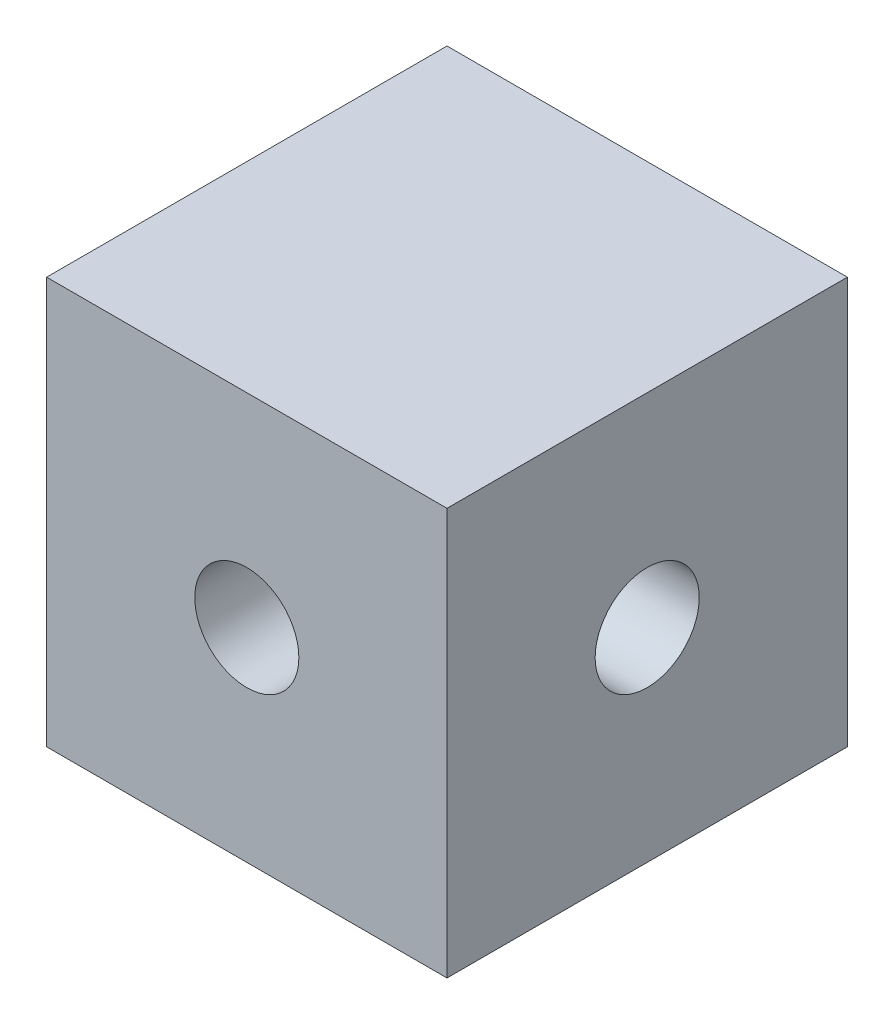
ISO-10303-21;
HEADER;
FILE_DESCRIPTION(('STEP AP214'),'2;1');
FILE_NAME('part.step','',(''),(''),'','','');
FILE_SCHEMA(('AUTOMOTIVE_DESIGN { 1 0 10303 214 1 1 1 1 }'));
ENDSEC;
DATA;
#1=APPLICATION_CONTEXT('core data for automotive mechanical design processes');
#2=APPLICATION_PROTOCOL_DEFINITION('international standard','automotive_design',2000,#1);
#3=PRODUCT_CONTEXT('',#1,'mechanical');
#4=PRODUCT('Part','Part','',(#3));
#5=PRODUCT_RELATED_PRODUCT_CATEGORY('part','',(#4));
#6=PRODUCT_DEFINITION_FORMATION('','',#4);
#7=PRODUCT_DEFINITION_CONTEXT('part definition',#1,'design');
#8=PRODUCT_DEFINITION('design','',#6,#7);
#9=PRODUCT_DEFINITION_SHAPE('','',#8);
#10=(LENGTH_UNIT() NAMED_UNIT(*) SI_UNIT(.MILLI.,.METRE.));
#11=(NAMED_UNIT(*) PLANE_ANGLE_UNIT() SI_UNIT($,.RADIAN.));
#12=(NAMED_UNIT(*) SI_UNIT($,.STERADIAN.) SOLID_ANGLE_UNIT());
#13=UNCERTAINTY_MEASURE_WITH_UNIT(LENGTH_MEASURE(1.E-05),#10,'distance_accuracy_value','');
#14=(GEOMETRIC_REPRESENTATION_CONTEXT(3) GLOBAL_UNCERTAINTY_ASSIGNED_CONTEXT((#13)) GLOBAL_UNIT_ASSIGNED_CONTEXT((#10,
#11,#12)) REPRESENTATION_CONTEXT('',''));
#15=CARTESIAN_POINT('',(0.,0.,0.));
#16=DIRECTION('',(0.,0.,1.));
#17=DIRECTION('',(1.,0.,0.));
#18=AXIS2_PLACEMENT_3D('',#15,#16,#17);
#19=CARTESIAN_POINT('',(10.,20.32,-10.));
#20=DIRECTION('',(-1.,0.,0.));
#21=DIRECTION('',(0.,0.,1.));
#22=AXIS2_PLACEMENT_3D('',#19,#20,#21);
#23=PLANE('',#22);
#24=CARTESIAN_POINT('',(10.,10.16,1.04744440165294E-13));
#25=DIRECTION('',(1.,0.,0.));
#26=DIRECTION('',(0.,0.,-1.));
#27=AXIS2_PLACEMENT_3D('',#24,#25,#26);
#28=CIRCLE('',#27,2.6);
#29=CARTESIAN_POINT('',(10.,10.16,-2.59999999999989));
#30=VERTEX_POINT('',#29);
#31=EDGE_CURVE('E166',#30,#30,#28,.T.);
#32=ORIENTED_EDGE('',*,*,#31,.F.);
#33=EDGE_LOOP('',(#32));
#34=FACE_BOUND('',#33,.T.);
#35=DIRECTION('',(0.,0.,-1.));
#36=VECTOR('',#35,1.);
#37=CARTESIAN_POINT('',(10.,0.,-10.));
#38=LINE('',#37,#36);
#39=CARTESIAN_POINT('',(10.,0.,10.));
#40=VERTEX_POINT('',#39);
#41=CARTESIAN_POINT('',(10.,0.,-10.));
#42=VERTEX_POINT('',#41);
#43=EDGE_CURVE('E110',#40,#42,#38,.T.);
#44=ORIENTED_EDGE('',*,*,#43,.T.);
#45=DIRECTION('',(0.,-1.,0.));
#46=VECTOR('',#45,1.);
#47=CARTESIAN_POINT('',(10.,20.32,-10.));
#48=LINE('',#47,#46);
#49=CARTESIAN_POINT('',(10.,20.32,-10.));
#50=VERTEX_POINT('',#49);
#51=EDGE_CURVE('E11',#50,#42,#48,.T.);
#52=ORIENTED_EDGE('',*,*,#51,.F.);
#53=DIRECTION('',(0.,0.,-1.));
#54=VECTOR('',#53,1.);
#55=CARTESIAN_POINT('',(10.,20.32,-10.));
#56=LINE('',#55,#54);
#57=CARTESIAN_POINT('',(10.,20.32,10.));
#58=VERTEX_POINT('',#57);
#59=EDGE_CURVE('E97',#58,#50,#56,.T.);
#60=ORIENTED_EDGE('',*,*,#59,.F.);
#61=DIRECTION('',(0.,-1.,0.));
#62=VECTOR('',#61,1.);
#63=CARTESIAN_POINT('',(10.,20.32,10.));
#64=LINE('',#63,#62);
#65=EDGE_CURVE('E111',#58,#40,#64,.T.);
#66=ORIENTED_EDGE('',*,*,#65,.T.);
#67=EDGE_LOOP('',(#44,#52,#60,#66));
#68=FACE_BOUND('',#67,.T.);
#69=ADVANCED_FACE('F42',(#34,#68),#23,.F.);
#70=CARTESIAN_POINT('',(-10.,20.32,-10.));
#71=DIRECTION('',(0.,0.,1.));
#72=DIRECTION('',(1.,0.,0.));
#73=AXIS2_PLACEMENT_3D('',#70,#71,#72);
#74=PLANE('',#73);
#75=CARTESIAN_POINT('',(0.,10.16,-10.));
#76=DIRECTION('',(0.,0.,-1.));
#77=DIRECTION('',(-1.,0.,0.));
#78=AXIS2_PLACEMENT_3D('',#75,#76,#77);
#79=CIRCLE('',#78,2.6);
#80=CARTESIAN_POINT('',(-2.6,10.16,-10.));
#81=VERTEX_POINT('',#80);
#82=EDGE_CURVE('E155',#81,#81,#79,.T.);
#83=ORIENTED_EDGE('',*,*,#82,.F.);
#84=EDGE_LOOP('',(#83));
#85=FACE_BOUND('',#84,.T.);
#86=DIRECTION('',(-1.,0.,0.));
#87=VECTOR('',#86,1.);
#88=CARTESIAN_POINT('',(-10.,0.,-10.));
#89=LINE('',#88,#87);
#90=CARTESIAN_POINT('',(-10.,0.,-10.));
#91=VERTEX_POINT('',#90);
#92=EDGE_CURVE('E115',#42,#91,#89,.T.);
#93=ORIENTED_EDGE('',*,*,#92,.T.);
#94=DIRECTION('',(0.,-1.,0.));
#95=VECTOR('',#94,1.);
#96=CARTESIAN_POINT('',(-10.,20.32,-10.));
#97=LINE('',#96,#95);
#98=CARTESIAN_POINT('',(-10.,20.32,-10.));
#99=VERTEX_POINT('',#98);
#100=EDGE_CURVE('E50',#99,#91,#97,.T.);
#101=ORIENTED_EDGE('',*,*,#100,.F.);
#102=DIRECTION('',(-1.,0.,0.));
#103=VECTOR('',#102,1.);
#104=CARTESIAN_POINT('',(-10.,20.32,-10.));
#105=LINE('',#104,#103);
#106=EDGE_CURVE('E87',#50,#99,#105,.T.);
#107=ORIENTED_EDGE('',*,*,#106,.F.);
#108=ORIENTED_EDGE('',*,*,#51,.T.);
#109=EDGE_LOOP('',(#93,#101,#107,#108));
#110=FACE_BOUND('',#109,.T.);
#111=ADVANCED_FACE('F89',(#85,#110),#74,.F.);
#112=CARTESIAN_POINT('',(-10.,20.32,-10.));
#113=DIRECTION('',(1.,0.,0.));
#114=DIRECTION('',(0.,0.,-1.));
#115=AXIS2_PLACEMENT_3D('',#112,#113,#114);
#116=PLANE('',#115);
#117=CARTESIAN_POINT('',(-10.,10.16,0.));
#118=DIRECTION('',(-1.,0.,0.));
#119=DIRECTION('',(0.,0.,1.));
#120=AXIS2_PLACEMENT_3D('',#117,#118,#119);
#121=CIRCLE('',#120,2.6);
#122=CARTESIAN_POINT('',(-10.,10.16,2.59999999999996));
#123=VERTEX_POINT('',#122);
#124=EDGE_CURVE('E123',#123,#123,#121,.T.);
#125=ORIENTED_EDGE('',*,*,#124,.F.);
#126=EDGE_LOOP('',(#125));
#127=FACE_BOUND('',#126,.T.);
#128=DIRECTION('',(0.,0.,1.));
#129=VECTOR('',#128,1.);
#130=CARTESIAN_POINT('',(-10.,0.,-10.));
#131=LINE('',#130,#129);
#132=CARTESIAN_POINT('',(-9.99999999999999,0.,10.));
#133=VERTEX_POINT('',#132);
#134=EDGE_CURVE('E120',#91,#133,#131,.T.);
#135=ORIENTED_EDGE('',*,*,#134,.T.);
#136=DIRECTION('',(0.,-1.,0.));
#137=VECTOR('',#136,1.);
#138=CARTESIAN_POINT('',(-9.99999999999999,20.32,10.));
#139=LINE('',#138,#137);
#140=CARTESIAN_POINT('',(-9.99999999999999,20.32,10.));
#141=VERTEX_POINT('',#140);
#142=EDGE_CURVE('E134',#141,#133,#139,.T.);
#143=ORIENTED_EDGE('',*,*,#142,.F.);
#144=DIRECTION('',(0.,0.,1.));
#145=VECTOR('',#144,1.);
#146=CARTESIAN_POINT('',(-10.,20.32,-10.));
#147=LINE('',#146,#145);
#148=EDGE_CURVE('E96',#99,#141,#147,.T.);
#149=ORIENTED_EDGE('',*,*,#148,.F.);
#150=ORIENTED_EDGE('',*,*,#100,.T.);
#151=EDGE_LOOP('',(#135,#143,#149,#150));
#152=FACE_BOUND('',#151,.T.);
#153=ADVANCED_FACE('F140',(#127,#152),#116,.F.);
#154=CARTESIAN_POINT('',(-9.99999999999999,20.32,10.));
#155=DIRECTION('',(0.,0.,-1.));
#156=DIRECTION('',(-1.,0.,0.));
#157=AXIS2_PLACEMENT_3D('',#154,#155,#156);
#158=PLANE('',#157);
#159=CARTESIAN_POINT('',(0.,10.16,10.));
#160=DIRECTION('',(0.,0.,1.));
#161=DIRECTION('',(1.,0.,0.));
#162=AXIS2_PLACEMENT_3D('',#159,#160,#161);
#163=CIRCLE('',#162,2.6);
#164=CARTESIAN_POINT('',(2.6,10.16,10.));
#165=VERTEX_POINT('',#164);
#166=EDGE_CURVE('E116',#165,#165,#163,.T.);
#167=ORIENTED_EDGE('',*,*,#166,.F.);
#168=EDGE_LOOP('',(#167));
#169=FACE_BOUND('',#168,.T.);
#170=DIRECTION('',(1.,0.,0.));
#171=VECTOR('',#170,1.);
#172=CARTESIAN_POINT('',(-9.99999999999999,0.,10.));
#173=LINE('',#172,#171);
#174=EDGE_CURVE('E107',#133,#40,#173,.T.);
#175=ORIENTED_EDGE('',*,*,#174,.T.);
#176=ORIENTED_EDGE('',*,*,#65,.F.);
#177=DIRECTION('',(1.,0.,0.));
#178=VECTOR('',#177,1.);
#179=CARTESIAN_POINT('',(-9.99999999999999,20.32,10.));
#180=LINE('',#179,#178);
#181=EDGE_CURVE('E102',#141,#58,#180,.T.);
#182=ORIENTED_EDGE('',*,*,#181,.F.);
#183=ORIENTED_EDGE('',*,*,#142,.T.);
#184=EDGE_LOOP('',(#175,#176,#182,#183));
#185=FACE_BOUND('',#184,.T.);
#186=ADVANCED_FACE('F144',(#169,#185),#158,.F.);
#187=CARTESIAN_POINT('',(0.,20.32,0.));
#188=DIRECTION('',(0.,1.,0.));
#189=DIRECTION('',(0.,0.,1.));
#190=AXIS2_PLACEMENT_3D('',#187,#188,#189);
#191=PLANE('',#190);
#192=ORIENTED_EDGE('',*,*,#59,.T.);
#193=ORIENTED_EDGE('',*,*,#106,.T.);
#194=ORIENTED_EDGE('',*,*,#148,.T.);
#195=ORIENTED_EDGE('',*,*,#181,.T.);
#196=EDGE_LOOP('',(#192,#193,#194,#195));
#197=FACE_BOUND('',#196,.T.);
#198=ADVANCED_FACE('F100',(#197),#191,.T.);
#199=CARTESIAN_POINT('',(0.,0.,0.));
#200=DIRECTION('',(0.,1.,0.));
#201=DIRECTION('',(0.,0.,1.));
#202=AXIS2_PLACEMENT_3D('',#199,#200,#201);
#203=PLANE('',#202);
#204=ORIENTED_EDGE('',*,*,#43,.F.);
#205=ORIENTED_EDGE('',*,*,#174,.F.);
#206=ORIENTED_EDGE('',*,*,#134,.F.);
#207=ORIENTED_EDGE('',*,*,#92,.F.);
#208=EDGE_LOOP('',(#204,#205,#206,#207));
#209=FACE_BOUND('',#208,.T.);
#210=ADVANCED_FACE('F142',(#209),#203,.F.);
#211=CARTESIAN_POINT('',(0.,10.16,-0.16));
#212=DIRECTION('',(0.,0.,1.));
#213=DIRECTION('',(1.,0.,0.));
#214=AXIS2_PLACEMENT_3D('',#211,#212,#213);
#215=CYLINDRICAL_SURFACE('',#214,2.6);
#216=CARTESIAN_POINT('',(0.,10.16,0.));
#217=DIRECTION('',(0.707106781186551,0.,-0.707106781186544));
#218=DIRECTION('',(-0.707106781186544,0.,-0.707106781186551));
#219=AXIS2_PLACEMENT_3D('',#216,#217,#218);
#220=ELLIPSE('',#219,3.67695526217007,2.6);
#221=CARTESIAN_POINT('',(0.,12.76,0.));
#222=VERTEX_POINT('',#221);
#223=CARTESIAN_POINT('',(0.,7.56,0.));
#224=VERTEX_POINT('',#223);
#225=EDGE_CURVE('E60',#222,#224,#220,.T.);
#226=ORIENTED_EDGE('',*,*,#225,.T.);
#227=CARTESIAN_POINT('',(0.,10.16,0.));
#228=DIRECTION('',(-0.707106781186544,0.,-0.707106781186551));
#229=DIRECTION('',(0.707106781186551,0.,-0.707106781186544));
#230=AXIS2_PLACEMENT_3D('',#227,#228,#229);
#231=ELLIPSE('',#230,3.67695526217003,2.6);
#232=EDGE_CURVE('E56',#224,#222,#231,.T.);
#233=ORIENTED_EDGE('',*,*,#232,.T.);
#234=EDGE_LOOP('',(#226,#233));
#235=FACE_BOUND('',#234,.T.);
#236=ORIENTED_EDGE('',*,*,#166,.T.);
#237=EDGE_LOOP('',(#236));
#238=FACE_BOUND('',#237,.T.);
#239=ADVANCED_FACE('F192',(#235,#238),#215,.F.);
#240=CARTESIAN_POINT('',(0.160000000000001,10.16,0.));
#241=DIRECTION('',(-1.,0.,0.));
#242=DIRECTION('',(0.,0.,1.));
#243=AXIS2_PLACEMENT_3D('',#240,#241,#242);
#244=CYLINDRICAL_SURFACE('',#243,2.6);
#245=ORIENTED_EDGE('',*,*,#31,.T.);
#246=EDGE_LOOP('',(#245));
#247=FACE_BOUND('',#246,.T.);
#248=ORIENTED_EDGE('',*,*,#225,.F.);
#249=CARTESIAN_POINT('',(0.,10.16,0.));
#250=DIRECTION('',(-0.707106781186544,0.,-0.707106781186551));
#251=DIRECTION('',(0.707106781186551,0.,-0.707106781186544));
#252=AXIS2_PLACEMENT_3D('',#249,#250,#251);
#253=ELLIPSE('',#252,3.67695526217003,2.6);
#254=EDGE_CURVE('E159',#224,#222,#253,.F.);
#255=ORIENTED_EDGE('',*,*,#254,.F.);
#256=EDGE_LOOP('',(#248,#255));
#257=FACE_BOUND('',#256,.T.);
#258=ADVANCED_FACE('F171',(#247,#257),#244,.F.);
#259=ORIENTED_EDGE('',*,*,#124,.T.);
#260=EDGE_LOOP('',(#259));
#261=FACE_BOUND('',#260,.T.);
#262=ORIENTED_EDGE('',*,*,#232,.F.);
#263=CARTESIAN_POINT('',(0.,10.16,0.));
#264=DIRECTION('',(-0.707106781186549,0.,0.707106781186546));
#265=DIRECTION('',(-0.707106781186546,0.,-0.707106781186549));
#266=AXIS2_PLACEMENT_3D('',#263,#264,#265);
#267=ELLIPSE('',#266,3.67695526217005,2.6);
#268=EDGE_CURVE('E151',#224,#222,#267,.F.);
#269=ORIENTED_EDGE('',*,*,#268,.T.);
#270=EDGE_LOOP('',(#262,#269));
#271=FACE_BOUND('',#270,.T.);
#272=ADVANCED_FACE('F199',(#261,#271),#244,.F.);
#273=ORIENTED_EDGE('',*,*,#254,.T.);
#274=ORIENTED_EDGE('',*,*,#268,.F.);
#275=EDGE_LOOP('',(#273,#274));
#276=FACE_BOUND('',#275,.T.);
#277=ORIENTED_EDGE('',*,*,#82,.T.);
#278=EDGE_LOOP('',(#277));
#279=FACE_BOUND('',#278,.T.);
#280=ADVANCED_FACE('F197',(#276,#279),#215,.F.);
#281=CLOSED_SHELL('',(#69,#111,#153,#186,#198,#210,#239,#258,#272,#280));
#282=MANIFOLD_SOLID_BREP('B2',#281);
#283=ADVANCED_BREP_SHAPE_REPRESENTATION('',(#18,#282),#14);
#284=SHAPE_DEFINITION_REPRESENTATION(#9,#283);
ENDSEC;
END-ISO-10303-21;
